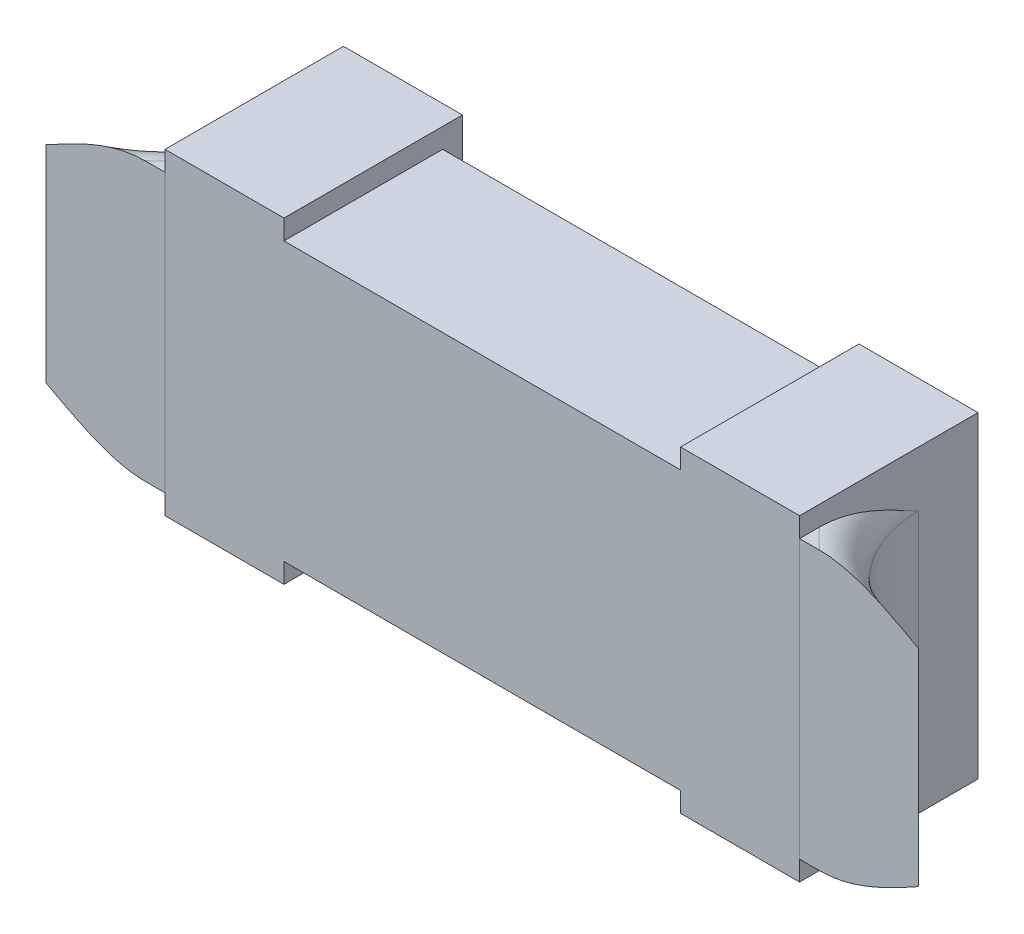
ISO-10303-21;
HEADER;
FILE_DESCRIPTION(('STEP AP214'),'2;1');
FILE_NAME('part.step','',(''),(''),'','','');
FILE_SCHEMA(('AUTOMOTIVE_DESIGN { 1 0 10303 214 1 1 1 1 }'));
ENDSEC;
DATA;
#1=APPLICATION_CONTEXT('core data for automotive mechanical design processes');
#2=APPLICATION_PROTOCOL_DEFINITION('international standard','automotive_design',2000,#1);
#3=PRODUCT_CONTEXT('',#1,'mechanical');
#4=PRODUCT('Part','Part','',(#3));
#5=PRODUCT_RELATED_PRODUCT_CATEGORY('part','',(#4));
#6=PRODUCT_DEFINITION_FORMATION('','',#4);
#7=PRODUCT_DEFINITION_CONTEXT('part definition',#1,'design');
#8=PRODUCT_DEFINITION('design','',#6,#7);
#9=PRODUCT_DEFINITION_SHAPE('','',#8);
#10=(LENGTH_UNIT() NAMED_UNIT(*) SI_UNIT(.MILLI.,.METRE.));
#11=(NAMED_UNIT(*) PLANE_ANGLE_UNIT() SI_UNIT($,.RADIAN.));
#12=(NAMED_UNIT(*) SI_UNIT($,.STERADIAN.) SOLID_ANGLE_UNIT());
#13=UNCERTAINTY_MEASURE_WITH_UNIT(LENGTH_MEASURE(1.E-05),#10,'distance_accuracy_value','');
#14=(GEOMETRIC_REPRESENTATION_CONTEXT(3) GLOBAL_UNCERTAINTY_ASSIGNED_CONTEXT((#13)) GLOBAL_UNIT_ASSIGNED_CONTEXT((#10,
#11,#12)) REPRESENTATION_CONTEXT('',''));
#15=CARTESIAN_POINT('',(0.,0.,0.));
#16=DIRECTION('',(0.,0.,1.));
#17=DIRECTION('',(1.,0.,0.));
#18=AXIS2_PLACEMENT_3D('',#15,#16,#17);
#19=CARTESIAN_POINT('',(-1.3,2.46,-7.3));
#20=DIRECTION('',(0.,1.,0.));
#21=DIRECTION('',(0.951056516295123,0.,-0.309016994375041));
#22=AXIS2_PLACEMENT_3D('',#19,#20,#21);
#23=TOROIDAL_SURFACE('',#22,0.39,0.09);
#24=CARTESIAN_POINT('',(-1.3,2.55,-7.3));
#25=DIRECTION('',(0.,-1.,0.));
#26=DIRECTION('',(0.,0.,-1.));
#27=AXIS2_PLACEMENT_3D('',#24,#25,#26);
#28=CIRCLE('',#27,0.39);
#29=CARTESIAN_POINT('',(-1.,2.55,-7.05080128411));
#30=VERTEX_POINT('',#29);
#31=CARTESIAN_POINT('',(-1.05080128411,2.55,-7.));
#32=VERTEX_POINT('',#31);
#33=EDGE_CURVE('P0_E76',#30,#32,#28,.T.);
#34=ORIENTED_EDGE('',*,*,#33,.F.);
#35=CARTESIAN_POINT('',(-1.,2.46,-7.3));
#36=CARTESIAN_POINT('',(-1.,2.50275885852349,-7.22193336217837));
#37=CARTESIAN_POINT('',(-1.,2.52032668273874,-7.1793231101722));
#38=CARTESIAN_POINT('',(-1.,2.55,-7.10735133319694));
#39=CARTESIAN_POINT('',(-1.,2.55,-7.05080128411246));
#40=B_SPLINE_CURVE_WITH_KNOTS('',2,(#35,#36,#37,#38,#39),.UNSPECIFIED.,.F.,.F.,(3,2,3),(0.,0.5,
1.),.UNSPECIFIED.);
#41=CARTESIAN_POINT('',(-1.,2.46,-7.3));
#42=VERTEX_POINT('',#41);
#43=EDGE_CURVE('P0_E28',#42,#30,#40,.T.);
#44=ORIENTED_EDGE('',*,*,#43,.F.);
#45=CARTESIAN_POINT('',(-1.3,2.46,-7.3));
#46=DIRECTION('',(0.,-1.,0.));
#47=DIRECTION('',(0.,0.,-1.));
#48=AXIS2_PLACEMENT_3D('',#45,#46,#47);
#49=CIRCLE('',#48,0.3);
#50=CARTESIAN_POINT('',(-1.3,2.46,-7.));
#51=VERTEX_POINT('',#50);
#52=EDGE_CURVE('P0_E78',#42,#51,#49,.T.);
#53=ORIENTED_EDGE('',*,*,#52,.T.);
#54=CARTESIAN_POINT('',(-1.05080128411246,2.55,-7.));
#55=CARTESIAN_POINT('',(-1.106816613526,2.55,-7.));
#56=CARTESIAN_POINT('',(-1.17932311017221,2.52032668273875,-7.));
#57=CARTESIAN_POINT('',(-1.22099773042441,2.50327132514066,-7.));
#58=CARTESIAN_POINT('',(-1.3,2.46,-7.));
#59=B_SPLINE_CURVE_WITH_KNOTS('',2,(#54,#55,#56,#57,#58),.UNSPECIFIED.,.F.,.F.,(3,2,3),(0.,0.5,
1.),.UNSPECIFIED.);
#60=EDGE_CURVE('P0_E11',#32,#51,#59,.T.);
#61=ORIENTED_EDGE('',*,*,#60,.F.);
#62=EDGE_LOOP('',(#34,#44,#53,#61));
#63=FACE_BOUND('',#62,.T.);
#64=ADVANCED_FACE('P0_F17',(#63),#23,.T.);
#65=CARTESIAN_POINT('',(0.6,2.55,-7.));
#66=DIRECTION('',(0.,0.,1.));
#67=DIRECTION('',(1.,0.,0.));
#68=AXIS2_PLACEMENT_3D('',#65,#66,#67);
#69=PLANE('',#68);
#70=ORIENTED_EDGE('',*,*,#60,.T.);
#71=DIRECTION('',(0.,1.,0.));
#72=VECTOR('',#71,1.);
#73=CARTESIAN_POINT('',(-1.3,2.86000000005,-7.));
#74=LINE('',#73,#72);
#75=CARTESIAN_POINT('',(-1.3,1.94,-7.));
#76=VERTEX_POINT('',#75);
#77=EDGE_CURVE('P0_E109',#76,#51,#74,.T.);
#78=ORIENTED_EDGE('',*,*,#77,.F.);
#79=CARTESIAN_POINT('',(-1.3,1.94,-7.));
#80=CARTESIAN_POINT('',(-1.22193336217879,1.89724114147674,-7.));
#81=CARTESIAN_POINT('',(-1.17932311017221,1.87967331726125,-7.));
#82=CARTESIAN_POINT('',(-1.10735133319718,1.85,-7.));
#83=CARTESIAN_POINT('',(-1.05080128411246,1.85,-7.));
#84=B_SPLINE_CURVE_WITH_KNOTS('',2,(#79,#80,#81,#82,#83),.UNSPECIFIED.,.F.,.F.,(3,2,3),(0.,0.5,
1.),.UNSPECIFIED.);
#85=CARTESIAN_POINT('',(-1.05080128411,1.85,-7.));
#86=VERTEX_POINT('',#85);
#87=EDGE_CURVE('P0_E95',#76,#86,#84,.T.);
#88=ORIENTED_EDGE('',*,*,#87,.T.);
#89=DIRECTION('',(-1.,0.,0.));
#90=VECTOR('',#89,1.);
#91=CARTESIAN_POINT('',(-1.02540064206,1.85,-7.));
#92=LINE('',#91,#90);
#93=CARTESIAN_POINT('',(-1.,1.85,-7.));
#94=VERTEX_POINT('',#93);
#95=EDGE_CURVE('P0_E186',#94,#86,#92,.T.);
#96=ORIENTED_EDGE('',*,*,#95,.F.);
#97=DIRECTION('',(0.,-1.,0.));
#98=VECTOR('',#97,1.);
#99=CARTESIAN_POINT('',(-1.,2.2,-7.));
#100=LINE('',#99,#98);
#101=CARTESIAN_POINT('',(-1.,2.55,-7.));
#102=VERTEX_POINT('',#101);
#103=EDGE_CURVE('P0_E86',#102,#94,#100,.T.);
#104=ORIENTED_EDGE('',*,*,#103,.F.);
#105=DIRECTION('',(-1.,0.,0.));
#106=VECTOR('',#105,1.);
#107=CARTESIAN_POINT('',(-1.02540064206,2.55,-7.));
#108=LINE('',#107,#106);
#109=EDGE_CURVE('P0_E83',#102,#32,#108,.T.);
#110=ORIENTED_EDGE('',*,*,#109,.T.);
#111=EDGE_LOOP('',(#70,#78,#88,#96,#104,#110));
#112=FACE_BOUND('',#111,.T.);
#113=ADVANCED_FACE('P0_F84',(#112),#69,.T.);
#114=CARTESIAN_POINT('',(-1.,12.4,-12.1460421085));
#115=DIRECTION('',(1.,0.,0.));
#116=DIRECTION('',(0.,1.,0.));
#117=AXIS2_PLACEMENT_3D('',#114,#115,#116);
#118=PLANE('',#117);
#119=DIRECTION('',(0.,0.,1.));
#120=VECTOR('',#119,1.);
#121=CARTESIAN_POINT('',(-1.,2.55,-7.02540064206));
#122=LINE('',#121,#120);
#123=EDGE_CURVE('P0_E91',#30,#102,#122,.T.);
#124=ORIENTED_EDGE('',*,*,#123,.T.);
#125=ORIENTED_EDGE('',*,*,#103,.T.);
#126=DIRECTION('',(0.,0.,-1.));
#127=VECTOR('',#126,1.);
#128=CARTESIAN_POINT('',(-1.,1.85,-7.02540064206));
#129=LINE('',#128,#127);
#130=CARTESIAN_POINT('',(-1.,1.85,-7.05080128411));
#131=VERTEX_POINT('',#130);
#132=EDGE_CURVE('P0_E158',#94,#131,#129,.T.);
#133=ORIENTED_EDGE('',*,*,#132,.T.);
#134=CARTESIAN_POINT('',(-1.,1.85,-7.05080128411246));
#135=CARTESIAN_POINT('',(-1.,1.85,-7.10681661352599));
#136=CARTESIAN_POINT('',(-1.,1.87967331726126,-7.1793231101722));
#137=CARTESIAN_POINT('',(-1.,1.89672867485934,-7.22099773042438));
#138=CARTESIAN_POINT('',(-1.,1.94,-7.3));
#139=B_SPLINE_CURVE_WITH_KNOTS('',2,(#134,#135,#136,#137,#138),.UNSPECIFIED.,.F.,.F.,(3,2,3),
(0.,0.5,1.),.UNSPECIFIED.);
#140=CARTESIAN_POINT('',(-1.,1.94,-7.3));
#141=VERTEX_POINT('',#140);
#142=EDGE_CURVE('P0_E101',#131,#141,#139,.T.);
#143=ORIENTED_EDGE('',*,*,#142,.T.);
#144=DIRECTION('',(0.,1.,0.));
#145=VECTOR('',#144,1.);
#146=CARTESIAN_POINT('',(-1.,2.86000000005,-7.3));
#147=LINE('',#146,#145);
#148=EDGE_CURVE('P0_E114',#141,#42,#147,.T.);
#149=ORIENTED_EDGE('',*,*,#148,.T.);
#150=ORIENTED_EDGE('',*,*,#43,.T.);
#151=EDGE_LOOP('',(#124,#125,#133,#143,#149,#150));
#152=FACE_BOUND('',#151,.T.);
#153=ADVANCED_FACE('P0_F125',(#152),#118,.T.);
#154=CARTESIAN_POINT('',(-1.3,2.86000000005,-7.3));
#155=DIRECTION('',(0.,1.,0.));
#156=DIRECTION('',(0.,0.,1.));
#157=AXIS2_PLACEMENT_3D('',#154,#155,#156);
#158=CYLINDRICAL_SURFACE('',#157,0.3);
#159=ORIENTED_EDGE('',*,*,#148,.F.);
#160=CARTESIAN_POINT('',(-1.3,1.94,-7.3));
#161=DIRECTION('',(0.,-1.,0.));
#162=DIRECTION('',(0.,0.,-1.));
#163=AXIS2_PLACEMENT_3D('',#160,#161,#162);
#164=CIRCLE('',#163,0.3);
#165=EDGE_CURVE('P0_E177',#141,#76,#164,.T.);
#166=ORIENTED_EDGE('',*,*,#165,.T.);
#167=ORIENTED_EDGE('',*,*,#77,.T.);
#168=ORIENTED_EDGE('',*,*,#52,.F.);
#169=EDGE_LOOP('',(#159,#166,#167,#168));
#170=FACE_BOUND('',#169,.T.);
#171=ADVANCED_FACE('P0_F134',(#170),#158,.F.);
#172=CARTESIAN_POINT('',(0.6,2.55,-7.3));
#173=DIRECTION('',(0.,1.,0.));
#174=DIRECTION('',(1.,0.,0.));
#175=AXIS2_PLACEMENT_3D('',#172,#173,#174);
#176=PLANE('',#175);
#177=ORIENTED_EDGE('',*,*,#33,.T.);
#178=ORIENTED_EDGE('',*,*,#109,.F.);
#179=ORIENTED_EDGE('',*,*,#123,.F.);
#180=EDGE_LOOP('',(#177,#178,#179));
#181=FACE_BOUND('',#180,.T.);
#182=ADVANCED_FACE('P0_F93',(#181),#176,.T.);
#183=CARTESIAN_POINT('',(-1.3,1.94,-7.3));
#184=DIRECTION('',(0.,-1.,0.));
#185=DIRECTION('',(-0.30901699437504,0.,0.951056516295124));
#186=AXIS2_PLACEMENT_3D('',#183,#184,#185);
#187=TOROIDAL_SURFACE('',#186,0.39,0.09);
#188=ORIENTED_EDGE('',*,*,#165,.F.);
#189=ORIENTED_EDGE('',*,*,#142,.F.);
#190=CARTESIAN_POINT('',(-1.3,1.85,-7.3));
#191=DIRECTION('',(0.,-1.,0.));
#192=DIRECTION('',(0.,0.,1.));
#193=AXIS2_PLACEMENT_3D('',#190,#191,#192);
#194=CIRCLE('',#193,0.39);
#195=EDGE_CURVE('P0_E194',#131,#86,#194,.T.);
#196=ORIENTED_EDGE('',*,*,#195,.T.);
#197=ORIENTED_EDGE('',*,*,#87,.F.);
#198=EDGE_LOOP('',(#188,#189,#196,#197));
#199=FACE_BOUND('',#198,.T.);
#200=ADVANCED_FACE('P0_F159',(#199),#187,.T.);
#201=CARTESIAN_POINT('',(0.6,1.85,-7.));
#202=DIRECTION('',(0.,-1.,0.));
#203=DIRECTION('',(0.,0.,-1.));
#204=AXIS2_PLACEMENT_3D('',#201,#202,#203);
#205=PLANE('',#204);
#206=ORIENTED_EDGE('',*,*,#195,.F.);
#207=ORIENTED_EDGE('',*,*,#132,.F.);
#208=ORIENTED_EDGE('',*,*,#95,.T.);
#209=EDGE_LOOP('',(#206,#207,#208));
#210=FACE_BOUND('',#209,.T.);
#211=ADVANCED_FACE('P0_F168',(#210),#205,.T.);
#212=CLOSED_SHELL('',(#64,#113,#153,#171,#182,#200,#211));
#213=MANIFOLD_SOLID_BREP('P0_B1',#212);
#214=CARTESIAN_POINT('',(0.9,2.46,-7.3));
#215=DIRECTION('',(0.,1.,0.));
#216=DIRECTION('',(-0.951056516295123,0.,-0.309016994375041));
#217=AXIS2_PLACEMENT_3D('',#214,#215,#216);
#218=TOROIDAL_SURFACE('',#217,0.39,0.09);
#219=CARTESIAN_POINT('',(0.650801284112457,2.55,-7.));
#220=CARTESIAN_POINT('',(0.653253312264449,2.54999994451816,-6.99999995815965));
#221=CARTESIAN_POINT('',(0.655705189605342,2.5499590883158,-6.99999901294568));
#222=CARTESIAN_POINT('',(0.660652520395519,2.54979839337325,-6.9999960784634));
#223=CARTESIAN_POINT('',(0.663147926546077,2.54967708430028,-6.99999406990223));
#224=CARTESIAN_POINT('',(0.66817882407363,2.54935551539409,-6.99998979464846));
#225=CARTESIAN_POINT('',(0.670714226148952,2.54915387027537,-6.99998752395161));
#226=CARTESIAN_POINT('',(0.675821759159319,2.54867180209705,-6.9999832953061));
#227=CARTESIAN_POINT('',(0.678393765364027,2.54839007467466,-6.99998134345768));
#228=CARTESIAN_POINT('',(0.686223207120273,2.54741957337387,-6.99997664421602));
#229=CARTESIAN_POINT('',(0.691466477785766,2.54661388486795,-6.99997521125875));
#230=CARTESIAN_POINT('',(0.702064756846417,2.54469957168819,-6.99997735307671));
#231=CARTESIAN_POINT('',(0.70741817841424,2.54358231615427,-6.99998108475295));
#232=CARTESIAN_POINT('',(0.718218066030505,2.54105380618194,-6.99999300001214));
#233=CARTESIAN_POINT('',(0.72366275134996,2.53963498992666,-7.00000130910876));
#234=CARTESIAN_POINT('',(0.734630029235078,2.53651534345188,-7.00002055594471));
#235=CARTESIAN_POINT('',(0.740150727708571,2.5348079062812,-7.00003155888559));
#236=CARTESIAN_POINT('',(0.751261233928922,2.53112869881358,-7.00005083476236));
#237=CARTESIAN_POINT('',(0.756849152067628,2.52915124703379,-7.0000590299733));
#238=CARTESIAN_POINT('',(0.768087372195507,2.52494412033039,-7.00007536090776));
#239=CARTESIAN_POINT('',(0.773735767091124,2.52270939402206,-7.00008349007784));
#240=CARTESIAN_POINT('',(0.786987554213083,2.51726568991456,-7.00006740939872));
#241=CARTESIAN_POINT('',(0.794565384429295,2.51399480017997,-7.00003055241639));
#242=CARTESIAN_POINT('',(0.811452627502866,2.50637181611034,-6.99996928638645));
#243=CARTESIAN_POINT('',(0.820731178579439,2.50195122506045,-6.99995014312121));
#244=CARTESIAN_POINT('',(0.840890745326393,2.49191699070747,-6.9999423008766));
#245=CARTESIAN_POINT('',(0.851738236617759,2.48623702449929,-6.99996013654015));
#246=CARTESIAN_POINT('',(0.875067715495158,2.47371932326278,-6.99999753206263));
#247=CARTESIAN_POINT('',(0.887529398878126,2.46684324402454,-7.00001690227587));
#248=CARTESIAN_POINT('',(0.9,2.46,-7.));
#249=B_SPLINE_CURVE_WITH_KNOTS('',3,(#219,#220,#221,#222,#223,#224,#225,#226,#227,#228,#229,
#230,#231,#232,#233,#234,#235,#236,#237,#238,#239,#240,#241,#242,#243,#244,#245,#246,#247,#248),
.UNSPECIFIED.,.F.,.F.,(4,2,2,2,2,2,2,2,2,2,2,2,2,2,4),(0.,0.00735552419947745,
0.0148493228779712,0.0224783592060558,0.0302395749510634,0.0461450025009299,0.0625443852972761,
0.0794175952840236,0.096748593023442,0.114526556126232,0.132746851598552,0.157503331091986,
0.18832814846499,0.225057987268149,0.267746080041115),.UNSPECIFIED.);
#250=CARTESIAN_POINT('',(0.650801284112,2.55,-7.));
#251=VERTEX_POINT('',#250);
#252=CARTESIAN_POINT('',(0.9,2.46,-7.));
#253=VERTEX_POINT('',#252);
#254=EDGE_CURVE('P1_E11',#251,#253,#249,.T.);
#255=ORIENTED_EDGE('',*,*,#254,.T.);
#256=CARTESIAN_POINT('',(0.9,2.46,-7.3));
#257=DIRECTION('',(0.,1.,0.));
#258=DIRECTION('',(0.,0.,1.));
#259=AXIS2_PLACEMENT_3D('',#256,#257,#258);
#260=CIRCLE('',#259,0.3);
#261=CARTESIAN_POINT('',(0.6,2.46,-7.3));
#262=VERTEX_POINT('',#261);
#263=EDGE_CURVE('P1_E96',#262,#253,#260,.T.);
#264=ORIENTED_EDGE('',*,*,#263,.F.);
#265=CARTESIAN_POINT('',(0.6,2.46,-7.3));
#266=CARTESIAN_POINT('',(0.60001689354969,2.46684214754964,-7.28753138372598));
#267=CARTESIAN_POINT('',(0.59999753277003,2.47371714647709,-7.27507170246074));
#268=CARTESIAN_POINT('',(0.599960118546997,2.48623354705635,-7.25174501420073));
#269=CARTESIAN_POINT('',(0.599942259476674,2.49191324953189,-7.2408982888476));
#270=CARTESIAN_POINT('',(0.599950002318599,2.50194772819937,-7.22073892186733));
#271=CARTESIAN_POINT('',(0.599969082961391,2.50636876729108,-7.21145977571666));
#272=CARTESIAN_POINT('',(0.600030361298407,2.51399312093574,-7.19456977436329));
#273=CARTESIAN_POINT('',(0.60006727381134,2.51726491120001,-7.18698977247091));
#274=CARTESIAN_POINT('',(0.600083587138803,2.52270905656794,-7.17373635122801));
#275=CARTESIAN_POINT('',(0.600075610148815,2.52494343720231,-7.16808853908516));
#276=CARTESIAN_POINT('',(0.600059503950848,2.52915007365561,-7.15685138211416));
#277=CARTESIAN_POINT('',(0.600051383126085,2.53112737232019,-7.15126394110458));
#278=CARTESIAN_POINT('',(0.600032214384607,2.53480640503047,-7.1401542418493));
#279=CARTESIAN_POINT('',(0.600021245099084,2.53651381240792,-7.13463387056514));
#280=CARTESIAN_POINT('',(0.600002013505939,2.5396335089719,-7.12366707664136));
#281=CARTESIAN_POINT('',(0.59999368741547,2.54105239579531,-7.11822254553513));
#282=CARTESIAN_POINT('',(0.599981699404497,2.54358111604171,-7.10742276930336));
#283=CARTESIAN_POINT('',(0.599977913219884,2.54469850121594,-7.10206930271102));
#284=CARTESIAN_POINT('',(0.599975641182318,2.54661310231937,-7.09147071577479));
#285=CARTESIAN_POINT('',(0.599976999315851,2.54741893818656,-7.08622718044995));
#286=CARTESIAN_POINT('',(0.599981589004686,2.54838964040699,-7.07839725130545));
#287=CARTESIAN_POINT('',(0.599983505264893,2.54867143379101,-7.07582502600418));
#288=CARTESIAN_POINT('',(0.599987667780892,2.54915362340713,-7.07071699542618));
#289=CARTESIAN_POINT('',(0.599989907870091,2.54935532247397,-7.06818131475285));
#290=CARTESIAN_POINT('',(0.599994130852381,2.54967698325148,-7.06314980005793));
#291=CARTESIAN_POINT('',(0.599996117596389,2.54979832866718,-7.06065405525046));
#292=CARTESIAN_POINT('',(0.599999021813163,2.54995907500796,-7.05570598711534));
#293=CARTESIAN_POINT('',(0.599999958313565,2.54999994462602,-7.05325371104162));
#294=CARTESIAN_POINT('',(0.6,2.55,-7.05080128411246));
#295=B_SPLINE_CURVE_WITH_KNOTS('',3,(#265,#266,#267,#268,#269,#270,#271,#272,#273,#274,#275,
#276,#277,#278,#279,#280,#281,#282,#283,#284,#285,#286,#287,#288,#289,#290,#291,#292,#293,#294),
.UNSPECIFIED.,.F.,.F.,(4,2,2,2,2,2,2,2,2,2,2,2,2,2,4),(0.,0.0426812779619908,0.0794087172858499,
0.110235721115502,0.134999244332268,0.153217534825344,0.170993999269068,0.188324034675264,
0.205196852076266,0.22159644672793,0.237502724433361,0.245264614717061,0.252894496506606,
0.260389314646355,0.267746034940733),.UNSPECIFIED.);
#296=CARTESIAN_POINT('',(0.6,2.55,-7.05080128411));
#297=VERTEX_POINT('',#296);
#298=EDGE_CURVE('P1_E92',#262,#297,#295,.T.);
#299=ORIENTED_EDGE('',*,*,#298,.T.);
#300=CARTESIAN_POINT('',(0.9,2.55,-7.3));
#301=DIRECTION('',(0.,1.,0.));
#302=DIRECTION('',(0.,0.,-1.));
#303=AXIS2_PLACEMENT_3D('',#300,#301,#302);
#304=CIRCLE('',#303,0.39);
#305=EDGE_CURVE('P1_E91',#297,#251,#304,.T.);
#306=ORIENTED_EDGE('',*,*,#305,.T.);
#307=EDGE_LOOP('',(#255,#264,#299,#306));
#308=FACE_BOUND('',#307,.T.);
#309=ADVANCED_FACE('P1_F17',(#308),#218,.T.);
#310=CARTESIAN_POINT('',(0.6,2.55,-7.));
#311=DIRECTION('',(0.,0.,1.));
#312=DIRECTION('',(1.,0.,0.));
#313=AXIS2_PLACEMENT_3D('',#310,#311,#312);
#314=PLANE('',#313);
#315=DIRECTION('',(1.,0.,0.));
#316=VECTOR('',#315,1.);
#317=CARTESIAN_POINT('',(0.625400642056,2.55,-7.));
#318=LINE('',#317,#316);
#319=CARTESIAN_POINT('',(0.6,2.55,-7.));
#320=VERTEX_POINT('',#319);
#321=EDGE_CURVE('P1_E83',#320,#251,#318,.T.);
#322=ORIENTED_EDGE('',*,*,#321,.F.);
#323=DIRECTION('',(0.,-1.,0.));
#324=VECTOR('',#323,1.);
#325=CARTESIAN_POINT('',(0.6,2.2,-7.));
#326=LINE('',#325,#324);
#327=CARTESIAN_POINT('',(0.6,1.85,-7.));
#328=VERTEX_POINT('',#327);
#329=EDGE_CURVE('P1_E29',#320,#328,#326,.T.);
#330=ORIENTED_EDGE('',*,*,#329,.T.);
#331=DIRECTION('',(1.,0.,0.));
#332=VECTOR('',#331,1.);
#333=CARTESIAN_POINT('',(0.625400642056,1.85,-7.));
#334=LINE('',#333,#332);
#335=CARTESIAN_POINT('',(0.650801284112,1.85,-7.));
#336=VERTEX_POINT('',#335);
#337=EDGE_CURVE('P1_E206',#328,#336,#334,.T.);
#338=ORIENTED_EDGE('',*,*,#337,.T.);
#339=CARTESIAN_POINT('',(0.9,1.94,-7.));
#340=CARTESIAN_POINT('',(0.887531383725709,1.93315785245021,-7.00001689354969));
#341=CARTESIAN_POINT('',(0.875071702460187,1.92628285352262,-6.99999753277003));
#342=CARTESIAN_POINT('',(0.851745014199793,1.91376645294319,-6.999960118547));
#343=CARTESIAN_POINT('',(0.840898288846558,1.90808675046763,-6.99994225947669));
#344=CARTESIAN_POINT('',(0.820738921866267,1.89805227180021,-6.99995000231865));
#345=CARTESIAN_POINT('',(0.81145977571569,1.89363123270858,-6.99996908296146));
#346=CARTESIAN_POINT('',(0.794569774362719,1.88600687906415,-7.00003036129851));
#347=CARTESIAN_POINT('',(0.786989772470648,1.88273508880002,-7.00006727381147));
#348=CARTESIAN_POINT('',(0.773736351228104,1.87729094343223,-7.00008358713894));
#349=CARTESIAN_POINT('',(0.768088539085309,1.87505656279787,-7.00007561014896));
#350=CARTESIAN_POINT('',(0.756851382114393,1.87084992634458,-7.00005950395099));
#351=CARTESIAN_POINT('',(0.751263941104843,1.86887262768,-7.00005138312622));
#352=CARTESIAN_POINT('',(0.740154241849622,1.86519359496971,-7.00003221438474));
#353=CARTESIAN_POINT('',(0.734633870565494,1.86348618759225,-7.00002124509921));
#354=CARTESIAN_POINT('',(0.723667076641746,1.86036649102826,-7.00000201350605));
#355=CARTESIAN_POINT('',(0.718222545535518,1.85894760420483,-6.99999368741557));
#356=CARTESIAN_POINT('',(0.707422769303756,1.8564188839584,-6.99998169940458));
#357=CARTESIAN_POINT('',(0.70206930271141,1.85530149878416,-6.99997791321996));
#358=CARTESIAN_POINT('',(0.691470715775149,1.8533868976807,-6.99997564118237));
#359=CARTESIAN_POINT('',(0.686227180450278,1.8525810618135,-6.99997699931589));
#360=CARTESIAN_POINT('',(0.67839725130574,1.85161035959304,-6.99998158900472));
#361=CARTESIAN_POINT('',(0.675825026004451,1.85132856620902,-6.99998350526492));
#362=CARTESIAN_POINT('',(0.670716995426404,1.85084637659289,-6.99998766778091));
#363=CARTESIAN_POINT('',(0.668181314753048,1.85064467752605,-6.9999899078701));
#364=CARTESIAN_POINT('',(0.66314980005808,1.85032301674853,-6.99999413085239));
#365=CARTESIAN_POINT('',(0.660654055250586,1.85020167133282,-6.99999611759639));
#366=CARTESIAN_POINT('',(0.655705987115398,1.85004092499204,-6.99999902181316));
#367=CARTESIAN_POINT('',(0.653253711041653,1.85000005537398,-6.99999995831357));
#368=CARTESIAN_POINT('',(0.650801284112457,1.85,-7.));
#369=B_SPLINE_CURVE_WITH_KNOTS('',3,(#339,#340,#341,#342,#343,#344,#345,#346,#347,#348,#349,
#350,#351,#352,#353,#354,#355,#356,#357,#358,#359,#360,#361,#362,#363,#364,#365,#366,#367,#368),
.UNSPECIFIED.,.F.,.F.,(4,2,2,2,2,2,2,2,2,2,2,2,2,2,4),(0.,0.0426812779629258,0.079408717287096,
0.11023572111641,0.134999244332149,0.153217534825084,0.170993999268706,0.188324034674841,
0.205196852075826,0.22159644672752,0.23750272443303,0.245264614716788,0.252894496506404,
0.260389314646238,0.267746034940713),.UNSPECIFIED.);
#370=CARTESIAN_POINT('',(0.9,1.94,-7.));
#371=VERTEX_POINT('',#370);
#372=EDGE_CURVE('P1_E203',#371,#336,#369,.T.);
#373=ORIENTED_EDGE('',*,*,#372,.F.);
#374=DIRECTION('',(0.,1.,0.));
#375=VECTOR('',#374,1.);
#376=CARTESIAN_POINT('',(0.9,2.86000000005,-7.));
#377=LINE('',#376,#375);
#378=EDGE_CURVE('P1_E86',#371,#253,#377,.T.);
#379=ORIENTED_EDGE('',*,*,#378,.T.);
#380=ORIENTED_EDGE('',*,*,#254,.F.);
#381=EDGE_LOOP('',(#322,#330,#338,#373,#379,#380));
#382=FACE_BOUND('',#381,.T.);
#383=ADVANCED_FACE('P1_F19',(#382),#314,.T.);
#384=CARTESIAN_POINT('',(0.6,12.4,-12.1460421085));
#385=DIRECTION('',(1.,0.,0.));
#386=DIRECTION('',(0.,1.,0.));
#387=AXIS2_PLACEMENT_3D('',#384,#385,#386);
#388=PLANE('',#387);
#389=ORIENTED_EDGE('',*,*,#298,.F.);
#390=DIRECTION('',(0.,1.,0.));
#391=VECTOR('',#390,1.);
#392=CARTESIAN_POINT('',(0.6,2.86000000005,-7.3));
#393=LINE('',#392,#391);
#394=CARTESIAN_POINT('',(0.6,1.94,-7.3));
#395=VERTEX_POINT('',#394);
#396=EDGE_CURVE('P1_E115',#395,#262,#393,.T.);
#397=ORIENTED_EDGE('',*,*,#396,.F.);
#398=CARTESIAN_POINT('',(0.6,1.85,-7.05080128411246));
#399=CARTESIAN_POINT('',(0.599999958159647,1.85000005548184,-7.05325331226475));
#400=CARTESIAN_POINT('',(0.599999012945684,1.85004091168421,-7.05570518960595));
#401=CARTESIAN_POINT('',(0.599996078463429,1.8502016066268,-7.06065252039668));
#402=CARTESIAN_POINT('',(0.599994069902277,1.8503229156998,-7.06314792654749));
#403=CARTESIAN_POINT('',(0.599989794648546,1.85064448460605,-7.06817882407551));
#404=CARTESIAN_POINT('',(0.599987523951717,1.85084612972481,-7.07071422615104));
#405=CARTESIAN_POINT('',(0.599983295306249,1.85132819790323,-7.07582175916178));
#406=CARTESIAN_POINT('',(0.599981343457862,1.85160992532567,-7.07839376536666));
#407=CARTESIAN_POINT('',(0.599976644216276,1.8525804266266,-7.08622320712327));
#408=CARTESIAN_POINT('',(0.599975211259052,1.85338611513264,-7.09146647778896));
#409=CARTESIAN_POINT('',(0.599977353077103,1.85530042831261,-7.10206475684984));
#410=CARTESIAN_POINT('',(0.599981084753379,1.85641768384662,-7.10741817841769));
#411=CARTESIAN_POINT('',(0.599993000012609,1.8589461938191,-7.11821806603386));
#412=CARTESIAN_POINT('',(0.600001309109231,1.86036501007443,-7.1236627513532));
#413=CARTESIAN_POINT('',(0.600020555945158,1.86348465654923,-7.13463002923794));
#414=CARTESIAN_POINT('',(0.600031558886004,1.86519209371987,-7.14015072771119));
#415=CARTESIAN_POINT('',(0.600050834762675,1.86887130118734,-7.15126123393092));
#416=CARTESIAN_POINT('',(0.600059029973554,1.87084875296701,-7.15684915206926));
#417=CARTESIAN_POINT('',(0.600075360907825,1.87505587967,-7.16808737219634));
#418=CARTESIAN_POINT('',(0.600083490077779,1.87729060597805,-7.17373576709152));
#419=CARTESIAN_POINT('',(0.600067409398482,1.88273431008606,-7.18698755421521));
#420=CARTESIAN_POINT('',(0.600030552416121,1.88600519982155,-7.19456538443355));
#421=CARTESIAN_POINT('',(0.599969286386209,1.89362818389255,-7.21145262750982));
#422=CARTESIAN_POINT('',(0.599950143121037,1.8980487749429,-7.22073117858698));
#423=CARTESIAN_POINT('',(0.599942300876551,1.90808300929614,-7.24089074533375));
#424=CARTESIAN_POINT('',(0.59996013654013,1.91376297550409,-7.25173823662437));
#425=CARTESIAN_POINT('',(0.599997532062628,1.92628067673934,-7.27506771549905));
#426=CARTESIAN_POINT('',(0.600016902275861,1.93315675597653,-7.28752939888006));
#427=CARTESIAN_POINT('',(0.6,1.94,-7.3));
#428=B_SPLINE_CURVE_WITH_KNOTS('',3,(#398,#399,#400,#401,#402,#403,#404,#405,#406,#407,#408,
#409,#410,#411,#412,#413,#414,#415,#416,#417,#418,#419,#420,#421,#422,#423,#424,#425,#426,#427),
.UNSPECIFIED.,.F.,.F.,(4,2,2,2,2,2,2,2,2,2,2,2,2,2,4),(0.,0.00735552420038118,
0.0148493228796434,0.0224783592083643,0.030239574953878,0.0461450025043778,0.062544385300872,
0.0794175952873073,0.0967485930259815,0.114526556127618,0.132746851598403,0.157503331098763,
0.188328148473937,0.225057987274775,0.267746080041099),.UNSPECIFIED.);
#429=CARTESIAN_POINT('',(0.6,1.85,-7.05080128411));
#430=VERTEX_POINT('',#429);
#431=EDGE_CURVE('P1_E174',#430,#395,#428,.T.);
#432=ORIENTED_EDGE('',*,*,#431,.F.);
#433=DIRECTION('',(0.,0.,-1.));
#434=VECTOR('',#433,1.);
#435=CARTESIAN_POINT('',(0.6,1.85,-7.02540064206));
#436=LINE('',#435,#434);
#437=EDGE_CURVE('P1_E213',#328,#430,#436,.T.);
#438=ORIENTED_EDGE('',*,*,#437,.F.);
#439=ORIENTED_EDGE('',*,*,#329,.F.);
#440=DIRECTION('',(0.,0.,1.));
#441=VECTOR('',#440,1.);
#442=CARTESIAN_POINT('',(0.6,2.55,-7.02540064206));
#443=LINE('',#442,#441);
#444=EDGE_CURVE('P1_E99',#297,#320,#443,.T.);
#445=ORIENTED_EDGE('',*,*,#444,.F.);
#446=EDGE_LOOP('',(#389,#397,#432,#438,#439,#445));
#447=FACE_BOUND('',#446,.T.);
#448=ADVANCED_FACE('P1_F137',(#447),#388,.F.);
#449=CARTESIAN_POINT('',(0.9,2.86000000005,-7.3));
#450=DIRECTION('',(0.,-1.,0.));
#451=DIRECTION('',(0.,0.,1.));
#452=AXIS2_PLACEMENT_3D('',#449,#450,#451);
#453=CYLINDRICAL_SURFACE('',#452,0.3);
#454=ORIENTED_EDGE('',*,*,#263,.T.);
#455=ORIENTED_EDGE('',*,*,#378,.F.);
#456=CARTESIAN_POINT('',(0.9,1.94,-7.3));
#457=DIRECTION('',(0.,1.,0.));
#458=DIRECTION('',(0.,0.,1.));
#459=AXIS2_PLACEMENT_3D('',#456,#457,#458);
#460=CIRCLE('',#459,0.3);
#461=EDGE_CURVE('P1_E106',#395,#371,#460,.T.);
#462=ORIENTED_EDGE('',*,*,#461,.F.);
#463=ORIENTED_EDGE('',*,*,#396,.T.);
#464=EDGE_LOOP('',(#454,#455,#462,#463));
#465=FACE_BOUND('',#464,.T.);
#466=ADVANCED_FACE('P1_F135',(#465),#453,.F.);
#467=CARTESIAN_POINT('',(0.6,2.55,-7.3));
#468=DIRECTION('',(0.,1.,0.));
#469=DIRECTION('',(1.,0.,0.));
#470=AXIS2_PLACEMENT_3D('',#467,#468,#469);
#471=PLANE('',#470);
#472=ORIENTED_EDGE('',*,*,#444,.T.);
#473=ORIENTED_EDGE('',*,*,#321,.T.);
#474=ORIENTED_EDGE('',*,*,#305,.F.);
#475=EDGE_LOOP('',(#472,#473,#474));
#476=FACE_BOUND('',#475,.T.);
#477=ADVANCED_FACE('P1_F98',(#476),#471,.T.);
#478=CARTESIAN_POINT('',(0.9,1.94,-7.3));
#479=DIRECTION('',(0.,-1.,0.));
#480=DIRECTION('',(0.30901699437504,0.,0.951056516295124));
#481=AXIS2_PLACEMENT_3D('',#478,#479,#480);
#482=TOROIDAL_SURFACE('',#481,0.39,0.09);
#483=ORIENTED_EDGE('',*,*,#372,.T.);
#484=CARTESIAN_POINT('',(0.9,1.85,-7.3));
#485=DIRECTION('',(0.,1.,0.));
#486=DIRECTION('',(0.,0.,1.));
#487=AXIS2_PLACEMENT_3D('',#484,#485,#486);
#488=CIRCLE('',#487,0.39);
#489=EDGE_CURVE('P1_E219',#430,#336,#488,.T.);
#490=ORIENTED_EDGE('',*,*,#489,.F.);
#491=ORIENTED_EDGE('',*,*,#431,.T.);
#492=ORIENTED_EDGE('',*,*,#461,.T.);
#493=EDGE_LOOP('',(#483,#490,#491,#492));
#494=FACE_BOUND('',#493,.T.);
#495=ADVANCED_FACE('P1_F179',(#494),#482,.T.);
#496=CARTESIAN_POINT('',(0.6,1.85,-7.));
#497=DIRECTION('',(0.,-1.,0.));
#498=DIRECTION('',(0.,0.,-1.));
#499=AXIS2_PLACEMENT_3D('',#496,#497,#498);
#500=PLANE('',#499);
#501=ORIENTED_EDGE('',*,*,#337,.F.);
#502=ORIENTED_EDGE('',*,*,#437,.T.);
#503=ORIENTED_EDGE('',*,*,#489,.T.);
#504=EDGE_LOOP('',(#501,#502,#503));
#505=FACE_BOUND('',#504,.T.);
#506=ADVANCED_FACE('P1_F188',(#505),#500,.T.);
#507=CLOSED_SHELL('',(#309,#383,#448,#466,#477,#495,#506));
#508=MANIFOLD_SOLID_BREP('P1_B1',#507);
#509=CARTESIAN_POINT('',(0.,0.,-7.));
#510=DIRECTION('',(0.,0.,1.));
#511=DIRECTION('',(1.,0.,0.));
#512=AXIS2_PLACEMENT_3D('',#509,#510,#511);
#513=PLANE('',#512);
#514=DIRECTION('',(1.,0.,0.));
#515=VECTOR('',#514,1.);
#516=CARTESIAN_POINT('',(-0.2,1.85,-7.));
#517=LINE('',#516,#515);
#518=CARTESIAN_POINT('',(-0.7,1.85,-7.));
#519=VERTEX_POINT('',#518);
#520=CARTESIAN_POINT('',(0.3,1.85,-7.));
#521=VERTEX_POINT('',#520);
#522=EDGE_CURVE('P2_E25',#519,#521,#517,.T.);
#523=ORIENTED_EDGE('',*,*,#522,.T.);
#524=DIRECTION('',(0.,-1.,0.));
#525=VECTOR('',#524,1.);
#526=CARTESIAN_POINT('',(0.3,1.825,-7.));
#527=LINE('',#526,#525);
#528=CARTESIAN_POINT('',(0.3,1.8,-7.));
#529=VERTEX_POINT('',#528);
#530=EDGE_CURVE('P2_E190',#521,#529,#527,.T.);
#531=ORIENTED_EDGE('',*,*,#530,.T.);
#532=DIRECTION('',(1.,0.,0.));
#533=VECTOR('',#532,1.);
#534=CARTESIAN_POINT('',(0.45,1.8,-7.));
#535=LINE('',#534,#533);
#536=CARTESIAN_POINT('',(0.6,1.8,-7.));
#537=VERTEX_POINT('',#536);
#538=EDGE_CURVE('P2_E176',#529,#537,#535,.T.);
#539=ORIENTED_EDGE('',*,*,#538,.T.);
#540=DIRECTION('',(0.,1.,0.));
#541=VECTOR('',#540,1.);
#542=CARTESIAN_POINT('',(0.6,2.2,-7.));
#543=LINE('',#542,#541);
#544=CARTESIAN_POINT('',(0.6,2.6,-7.));
#545=VERTEX_POINT('',#544);
#546=EDGE_CURVE('P2_E148',#537,#545,#543,.T.);
#547=ORIENTED_EDGE('',*,*,#546,.T.);
#548=DIRECTION('',(-1.,0.,0.));
#549=VECTOR('',#548,1.);
#550=CARTESIAN_POINT('',(0.45,2.6,-7.));
#551=LINE('',#550,#549);
#552=CARTESIAN_POINT('',(0.3,2.6,-7.));
#553=VERTEX_POINT('',#552);
#554=EDGE_CURVE('P2_E147',#545,#553,#551,.T.);
#555=ORIENTED_EDGE('',*,*,#554,.T.);
#556=DIRECTION('',(0.,-1.,0.));
#557=VECTOR('',#556,1.);
#558=CARTESIAN_POINT('',(0.3,2.575,-7.));
#559=LINE('',#558,#557);
#560=CARTESIAN_POINT('',(0.3,2.55,-7.));
#561=VERTEX_POINT('',#560);
#562=EDGE_CURVE('P2_E143',#553,#561,#559,.T.);
#563=ORIENTED_EDGE('',*,*,#562,.T.);
#564=DIRECTION('',(-1.,0.,0.));
#565=VECTOR('',#564,1.);
#566=CARTESIAN_POINT('',(-0.2,2.55,-7.));
#567=LINE('',#566,#565);
#568=CARTESIAN_POINT('',(-0.7,2.55,-7.));
#569=VERTEX_POINT('',#568);
#570=EDGE_CURVE('P2_E11',#561,#569,#567,.T.);
#571=ORIENTED_EDGE('',*,*,#570,.T.);
#572=DIRECTION('',(0.,1.,0.));
#573=VECTOR('',#572,1.);
#574=CARTESIAN_POINT('',(-0.7,2.575,-7.));
#575=LINE('',#574,#573);
#576=CARTESIAN_POINT('',(-0.7,2.6,-7.));
#577=VERTEX_POINT('',#576);
#578=EDGE_CURVE('P2_E261',#569,#577,#575,.T.);
#579=ORIENTED_EDGE('',*,*,#578,.T.);
#580=DIRECTION('',(-1.,0.,0.));
#581=VECTOR('',#580,1.);
#582=CARTESIAN_POINT('',(-0.85,2.6,-7.));
#583=LINE('',#582,#581);
#584=CARTESIAN_POINT('',(-1.,2.6,-7.));
#585=VERTEX_POINT('',#584);
#586=EDGE_CURVE('P2_E37',#577,#585,#583,.T.);
#587=ORIENTED_EDGE('',*,*,#586,.T.);
#588=DIRECTION('',(0.,-1.,0.));
#589=VECTOR('',#588,1.);
#590=CARTESIAN_POINT('',(-1.,2.2,-7.));
#591=LINE('',#590,#589);
#592=CARTESIAN_POINT('',(-1.,1.8,-7.));
#593=VERTEX_POINT('',#592);
#594=EDGE_CURVE('P2_E229',#585,#593,#591,.T.);
#595=ORIENTED_EDGE('',*,*,#594,.T.);
#596=DIRECTION('',(1.,0.,0.));
#597=VECTOR('',#596,1.);
#598=CARTESIAN_POINT('',(-0.85,1.8,-7.));
#599=LINE('',#598,#597);
#600=CARTESIAN_POINT('',(-0.7,1.8,-7.));
#601=VERTEX_POINT('',#600);
#602=EDGE_CURVE('P2_E240',#593,#601,#599,.T.);
#603=ORIENTED_EDGE('',*,*,#602,.T.);
#604=DIRECTION('',(0.,1.,0.));
#605=VECTOR('',#604,1.);
#606=CARTESIAN_POINT('',(-0.7,1.825,-7.));
#607=LINE('',#606,#605);
#608=EDGE_CURVE('P2_E248',#601,#519,#607,.T.);
#609=ORIENTED_EDGE('',*,*,#608,.T.);
#610=EDGE_LOOP('',(#523,#531,#539,#547,#555,#563,#571,#579,#587,#595,#603,#609));
#611=FACE_BOUND('',#610,.T.);
#612=ADVANCED_FACE('P2_F17',(#611),#513,.T.);
#613=CARTESIAN_POINT('',(-0.95,2.55,-7.));
#614=DIRECTION('',(0.,1.,0.));
#615=DIRECTION('',(1.,0.,0.));
#616=AXIS2_PLACEMENT_3D('',#613,#614,#615);
#617=PLANE('',#616);
#618=DIRECTION('',(0.,0.,-1.));
#619=VECTOR('',#618,1.);
#620=CARTESIAN_POINT('',(-0.7,2.55,-7.2));
#621=LINE('',#620,#619);
#622=CARTESIAN_POINT('',(-0.7,2.55,-7.4));
#623=VERTEX_POINT('',#622);
#624=EDGE_CURVE('P2_E244',#569,#623,#621,.T.);
#625=ORIENTED_EDGE('',*,*,#624,.F.);
#626=ORIENTED_EDGE('',*,*,#570,.F.);
#627=DIRECTION('',(0.,0.,-1.));
#628=VECTOR('',#627,1.);
#629=CARTESIAN_POINT('',(0.3,2.55,-7.2));
#630=LINE('',#629,#628);
#631=CARTESIAN_POINT('',(0.3,2.55,-7.4));
#632=VERTEX_POINT('',#631);
#633=EDGE_CURVE('P2_E205',#561,#632,#630,.T.);
#634=ORIENTED_EDGE('',*,*,#633,.T.);
#635=DIRECTION('',(-1.,0.,0.));
#636=VECTOR('',#635,1.);
#637=CARTESIAN_POINT('',(-0.2,2.55,-7.4));
#638=LINE('',#637,#636);
#639=EDGE_CURVE('P2_E266',#632,#623,#638,.T.);
#640=ORIENTED_EDGE('',*,*,#639,.T.);
#641=EDGE_LOOP('',(#625,#626,#634,#640));
#642=FACE_BOUND('',#641,.T.);
#643=ADVANCED_FACE('P2_F295',(#642),#617,.T.);
#644=CARTESIAN_POINT('',(0.55,1.85,-7.));
#645=DIRECTION('',(0.,-1.,0.));
#646=DIRECTION('',(0.,0.,-1.));
#647=AXIS2_PLACEMENT_3D('',#644,#645,#646);
#648=PLANE('',#647);
#649=DIRECTION('',(0.,0.,-1.));
#650=VECTOR('',#649,1.);
#651=CARTESIAN_POINT('',(0.3,1.85,-7.2));
#652=LINE('',#651,#650);
#653=CARTESIAN_POINT('',(0.3,1.85,-7.4));
#654=VERTEX_POINT('',#653);
#655=EDGE_CURVE('P2_E193',#521,#654,#652,.T.);
#656=ORIENTED_EDGE('',*,*,#655,.F.);
#657=ORIENTED_EDGE('',*,*,#522,.F.);
#658=DIRECTION('',(0.,0.,-1.));
#659=VECTOR('',#658,1.);
#660=CARTESIAN_POINT('',(-0.7,1.85,-7.2));
#661=LINE('',#660,#659);
#662=CARTESIAN_POINT('',(-0.7,1.85,-7.4));
#663=VERTEX_POINT('',#662);
#664=EDGE_CURVE('P2_E245',#519,#663,#661,.T.);
#665=ORIENTED_EDGE('',*,*,#664,.T.);
#666=DIRECTION('',(1.,0.,0.));
#667=VECTOR('',#666,1.);
#668=CARTESIAN_POINT('',(-0.2,1.85,-7.4));
#669=LINE('',#668,#667);
#670=EDGE_CURVE('P2_E269',#663,#654,#669,.T.);
#671=ORIENTED_EDGE('',*,*,#670,.T.);
#672=EDGE_LOOP('',(#656,#657,#665,#671));
#673=FACE_BOUND('',#672,.T.);
#674=ADVANCED_FACE('P2_F278',(#673),#648,.T.);
#675=CARTESIAN_POINT('',(0.,0.,-7.4));
#676=DIRECTION('',(0.,0.,1.));
#677=DIRECTION('',(1.,0.,0.));
#678=AXIS2_PLACEMENT_3D('',#675,#676,#677);
#679=PLANE('',#678);
#680=ORIENTED_EDGE('',*,*,#639,.F.);
#681=DIRECTION('',(0.,-1.,0.));
#682=VECTOR('',#681,1.);
#683=CARTESIAN_POINT('',(0.3,2.2,-7.4));
#684=LINE('',#683,#682);
#685=EDGE_CURVE('P2_E199',#632,#654,#684,.T.);
#686=ORIENTED_EDGE('',*,*,#685,.T.);
#687=ORIENTED_EDGE('',*,*,#670,.F.);
#688=DIRECTION('',(0.,-1.,0.));
#689=VECTOR('',#688,1.);
#690=CARTESIAN_POINT('',(-0.7,2.2,-7.4));
#691=LINE('',#690,#689);
#692=EDGE_CURVE('P2_E249',#623,#663,#691,.T.);
#693=ORIENTED_EDGE('',*,*,#692,.F.);
#694=EDGE_LOOP('',(#680,#686,#687,#693));
#695=FACE_BOUND('',#694,.T.);
#696=ADVANCED_FACE('P2_F304',(#695),#679,.F.);
#697=CARTESIAN_POINT('',(0.3,2.6,-7.));
#698=DIRECTION('',(0.,1.,0.));
#699=DIRECTION('',(1.,0.,0.));
#700=AXIS2_PLACEMENT_3D('',#697,#698,#699);
#701=PLANE('',#700);
#702=DIRECTION('',(0.,0.,1.));
#703=VECTOR('',#702,1.);
#704=CARTESIAN_POINT('',(-1.,2.6,-7.225));
#705=LINE('',#704,#703);
#706=CARTESIAN_POINT('',(-1.,2.6,-7.45));
#707=VERTEX_POINT('',#706);
#708=EDGE_CURVE('P2_E233',#707,#585,#705,.T.);
#709=ORIENTED_EDGE('',*,*,#708,.T.);
#710=ORIENTED_EDGE('',*,*,#586,.F.);
#711=DIRECTION('',(0.,0.,-1.));
#712=VECTOR('',#711,1.);
#713=CARTESIAN_POINT('',(-0.7,2.6,-7.225));
#714=LINE('',#713,#712);
#715=CARTESIAN_POINT('',(-0.7,2.6,-7.45));
#716=VERTEX_POINT('',#715);
#717=EDGE_CURVE('P2_E258',#577,#716,#714,.T.);
#718=ORIENTED_EDGE('',*,*,#717,.T.);
#719=DIRECTION('',(-1.,0.,0.));
#720=VECTOR('',#719,1.);
#721=CARTESIAN_POINT('',(-0.85,2.6,-7.45));
#722=LINE('',#721,#720);
#723=EDGE_CURVE('P2_E209',#716,#707,#722,.T.);
#724=ORIENTED_EDGE('',*,*,#723,.T.);
#725=EDGE_LOOP('',(#709,#710,#718,#724));
#726=FACE_BOUND('',#725,.T.);
#727=ADVANCED_FACE('P2_F324',(#726),#701,.T.);
#728=CARTESIAN_POINT('',(-0.7,1.8,-7.));
#729=DIRECTION('',(-1.,0.,0.));
#730=DIRECTION('',(0.,0.,1.));
#731=AXIS2_PLACEMENT_3D('',#728,#729,#730);
#732=PLANE('',#731);
#733=ORIENTED_EDGE('',*,*,#624,.T.);
#734=ORIENTED_EDGE('',*,*,#692,.T.);
#735=ORIENTED_EDGE('',*,*,#664,.F.);
#736=ORIENTED_EDGE('',*,*,#608,.F.);
#737=DIRECTION('',(0.,0.,1.));
#738=VECTOR('',#737,1.);
#739=CARTESIAN_POINT('',(-0.7,1.8,-7.225));
#740=LINE('',#739,#738);
#741=CARTESIAN_POINT('',(-0.7,1.8,-7.45));
#742=VERTEX_POINT('',#741);
#743=EDGE_CURVE('P2_E236',#742,#601,#740,.T.);
#744=ORIENTED_EDGE('',*,*,#743,.F.);
#745=DIRECTION('',(0.,1.,0.));
#746=VECTOR('',#745,1.);
#747=CARTESIAN_POINT('',(-0.7,2.2,-7.45));
#748=LINE('',#747,#746);
#749=EDGE_CURVE('P2_E213',#742,#716,#748,.T.);
#750=ORIENTED_EDGE('',*,*,#749,.T.);
#751=ORIENTED_EDGE('',*,*,#717,.F.);
#752=ORIENTED_EDGE('',*,*,#578,.F.);
#753=EDGE_LOOP('',(#733,#734,#735,#736,#744,#750,#751,#752));
#754=FACE_BOUND('',#753,.T.);
#755=ADVANCED_FACE('P2_F321',(#754),#732,.F.);
#756=CARTESIAN_POINT('',(0.6,1.8,-7.));
#757=DIRECTION('',(0.,-1.,0.));
#758=DIRECTION('',(0.,0.,-1.));
#759=AXIS2_PLACEMENT_3D('',#756,#757,#758);
#760=PLANE('',#759);
#761=ORIENTED_EDGE('',*,*,#743,.T.);
#762=ORIENTED_EDGE('',*,*,#602,.F.);
#763=DIRECTION('',(0.,0.,1.));
#764=VECTOR('',#763,1.);
#765=CARTESIAN_POINT('',(-1.,1.8,-7.225));
#766=LINE('',#765,#764);
#767=CARTESIAN_POINT('',(-1.,1.8,-7.45));
#768=VERTEX_POINT('',#767);
#769=EDGE_CURVE('P2_E225',#768,#593,#766,.T.);
#770=ORIENTED_EDGE('',*,*,#769,.F.);
#771=DIRECTION('',(-1.,0.,0.));
#772=VECTOR('',#771,1.);
#773=CARTESIAN_POINT('',(-0.85,1.8,-7.45));
#774=LINE('',#773,#772);
#775=EDGE_CURVE('P2_E217',#742,#768,#774,.T.);
#776=ORIENTED_EDGE('',*,*,#775,.F.);
#777=EDGE_LOOP('',(#761,#762,#770,#776));
#778=FACE_BOUND('',#777,.T.);
#779=ADVANCED_FACE('P2_F314',(#778),#760,.T.);
#780=CARTESIAN_POINT('',(-1.,2.6,-7.));
#781=DIRECTION('',(1.,0.,0.));
#782=DIRECTION('',(0.,1.,0.));
#783=AXIS2_PLACEMENT_3D('',#780,#781,#782);
#784=PLANE('',#783);
#785=DIRECTION('',(0.,1.,0.));
#786=VECTOR('',#785,1.);
#787=CARTESIAN_POINT('',(-1.,2.2,-7.45));
#788=LINE('',#787,#786);
#789=EDGE_CURVE('P2_E221',#768,#707,#788,.T.);
#790=ORIENTED_EDGE('',*,*,#789,.F.);
#791=ORIENTED_EDGE('',*,*,#769,.T.);
#792=ORIENTED_EDGE('',*,*,#594,.F.);
#793=ORIENTED_EDGE('',*,*,#708,.F.);
#794=EDGE_LOOP('',(#790,#791,#792,#793));
#795=FACE_BOUND('',#794,.T.);
#796=ADVANCED_FACE('P2_F310',(#795),#784,.F.);
#797=CARTESIAN_POINT('',(0.,0.,-7.45));
#798=DIRECTION('',(0.,0.,1.));
#799=DIRECTION('',(1.,0.,0.));
#800=AXIS2_PLACEMENT_3D('',#797,#798,#799);
#801=PLANE('',#800);
#802=ORIENTED_EDGE('',*,*,#723,.F.);
#803=ORIENTED_EDGE('',*,*,#749,.F.);
#804=ORIENTED_EDGE('',*,*,#775,.T.);
#805=ORIENTED_EDGE('',*,*,#789,.T.);
#806=EDGE_LOOP('',(#802,#803,#804,#805));
#807=FACE_BOUND('',#806,.T.);
#808=ADVANCED_FACE('P2_F313',(#807),#801,.F.);
#809=CARTESIAN_POINT('',(0.3,1.8,-7.));
#810=DIRECTION('',(-1.,0.,0.));
#811=DIRECTION('',(0.,0.,1.));
#812=AXIS2_PLACEMENT_3D('',#809,#810,#811);
#813=PLANE('',#812);
#814=ORIENTED_EDGE('',*,*,#562,.F.);
#815=DIRECTION('',(0.,0.,1.));
#816=VECTOR('',#815,1.);
#817=CARTESIAN_POINT('',(0.3,2.6,-7.225));
#818=LINE('',#817,#816);
#819=CARTESIAN_POINT('',(0.3,2.6,-7.45));
#820=VERTEX_POINT('',#819);
#821=EDGE_CURVE('P2_E135',#820,#553,#818,.T.);
#822=ORIENTED_EDGE('',*,*,#821,.F.);
#823=DIRECTION('',(0.,-1.,0.));
#824=VECTOR('',#823,1.);
#825=CARTESIAN_POINT('',(0.3,2.2,-7.45));
#826=LINE('',#825,#824);
#827=CARTESIAN_POINT('',(0.3,1.8,-7.45));
#828=VERTEX_POINT('',#827);
#829=EDGE_CURVE('P2_E140',#820,#828,#826,.T.);
#830=ORIENTED_EDGE('',*,*,#829,.T.);
#831=DIRECTION('',(0.,0.,1.));
#832=VECTOR('',#831,1.);
#833=CARTESIAN_POINT('',(0.3,1.8,-7.225));
#834=LINE('',#833,#832);
#835=EDGE_CURVE('P2_E181',#828,#529,#834,.T.);
#836=ORIENTED_EDGE('',*,*,#835,.T.);
#837=ORIENTED_EDGE('',*,*,#530,.F.);
#838=ORIENTED_EDGE('',*,*,#655,.T.);
#839=ORIENTED_EDGE('',*,*,#685,.F.);
#840=ORIENTED_EDGE('',*,*,#633,.F.);
#841=EDGE_LOOP('',(#814,#822,#830,#836,#837,#838,#839,#840));
#842=FACE_BOUND('',#841,.T.);
#843=ADVANCED_FACE('P2_F137',(#842),#813,.T.);
#844=CARTESIAN_POINT('',(0.3,2.6,-7.));
#845=DIRECTION('',(0.,1.,0.));
#846=DIRECTION('',(1.,0.,0.));
#847=AXIS2_PLACEMENT_3D('',#844,#845,#846);
#848=PLANE('',#847);
#849=ORIENTED_EDGE('',*,*,#821,.T.);
#850=ORIENTED_EDGE('',*,*,#554,.F.);
#851=DIRECTION('',(0.,0.,1.));
#852=VECTOR('',#851,1.);
#853=CARTESIAN_POINT('',(0.6,2.6,-7.225));
#854=LINE('',#853,#852);
#855=CARTESIAN_POINT('',(0.6,2.6,-7.45));
#856=VERTEX_POINT('',#855);
#857=EDGE_CURVE('P2_E154',#856,#545,#854,.T.);
#858=ORIENTED_EDGE('',*,*,#857,.F.);
#859=DIRECTION('',(-1.,0.,0.));
#860=VECTOR('',#859,1.);
#861=CARTESIAN_POINT('',(0.45,2.6,-7.45));
#862=LINE('',#861,#860);
#863=EDGE_CURVE('P2_E151',#856,#820,#862,.T.);
#864=ORIENTED_EDGE('',*,*,#863,.T.);
#865=EDGE_LOOP('',(#849,#850,#858,#864));
#866=FACE_BOUND('',#865,.T.);
#867=ADVANCED_FACE('P2_F152',(#866),#848,.T.);
#868=CARTESIAN_POINT('',(0.6,2.6,-7.));
#869=DIRECTION('',(1.,0.,0.));
#870=DIRECTION('',(0.,1.,0.));
#871=AXIS2_PLACEMENT_3D('',#868,#869,#870);
#872=PLANE('',#871);
#873=ORIENTED_EDGE('',*,*,#857,.T.);
#874=ORIENTED_EDGE('',*,*,#546,.F.);
#875=DIRECTION('',(0.,0.,1.));
#876=VECTOR('',#875,1.);
#877=CARTESIAN_POINT('',(0.6,1.8,-7.225));
#878=LINE('',#877,#876);
#879=CARTESIAN_POINT('',(0.6,1.8,-7.45));
#880=VERTEX_POINT('',#879);
#881=EDGE_CURVE('P2_E177',#880,#537,#878,.T.);
#882=ORIENTED_EDGE('',*,*,#881,.F.);
#883=DIRECTION('',(0.,-1.,0.));
#884=VECTOR('',#883,1.);
#885=CARTESIAN_POINT('',(0.6,2.2,-7.45));
#886=LINE('',#885,#884);
#887=EDGE_CURVE('P2_E159',#856,#880,#886,.T.);
#888=ORIENTED_EDGE('',*,*,#887,.F.);
#889=EDGE_LOOP('',(#873,#874,#882,#888));
#890=FACE_BOUND('',#889,.T.);
#891=ADVANCED_FACE('P2_F283',(#890),#872,.T.);
#892=CARTESIAN_POINT('',(0.6,1.8,-7.));
#893=DIRECTION('',(0.,-1.,0.));
#894=DIRECTION('',(0.,0.,-1.));
#895=AXIS2_PLACEMENT_3D('',#892,#893,#894);
#896=PLANE('',#895);
#897=ORIENTED_EDGE('',*,*,#835,.F.);
#898=DIRECTION('',(-1.,0.,0.));
#899=VECTOR('',#898,1.);
#900=CARTESIAN_POINT('',(0.45,1.8,-7.45));
#901=LINE('',#900,#899);
#902=EDGE_CURVE('P2_E164',#880,#828,#901,.T.);
#903=ORIENTED_EDGE('',*,*,#902,.F.);
#904=ORIENTED_EDGE('',*,*,#881,.T.);
#905=ORIENTED_EDGE('',*,*,#538,.F.);
#906=EDGE_LOOP('',(#897,#903,#904,#905));
#907=FACE_BOUND('',#906,.T.);
#908=ADVANCED_FACE('P2_F281',(#907),#896,.T.);
#909=CARTESIAN_POINT('',(0.,0.,-7.45));
#910=DIRECTION('',(0.,0.,1.));
#911=DIRECTION('',(1.,0.,0.));
#912=AXIS2_PLACEMENT_3D('',#909,#910,#911);
#913=PLANE('',#912);
#914=ORIENTED_EDGE('',*,*,#829,.F.);
#915=ORIENTED_EDGE('',*,*,#863,.F.);
#916=ORIENTED_EDGE('',*,*,#887,.T.);
#917=ORIENTED_EDGE('',*,*,#902,.T.);
#918=EDGE_LOOP('',(#914,#915,#916,#917));
#919=FACE_BOUND('',#918,.T.);
#920=ADVANCED_FACE('P2_F162',(#919),#913,.F.);
#921=CLOSED_SHELL('',(#612,#643,#674,#696,#727,#755,#779,#796,#808,#843,#867,#891,#908,#920));
#922=MANIFOLD_SOLID_BREP('P2_B1',#921);
#923=ADVANCED_BREP_SHAPE_REPRESENTATION('',(#18,#213,#508,#922),#14);
#924=SHAPE_DEFINITION_REPRESENTATION(#9,#923);
ENDSEC;
END-ISO-10303-21;
